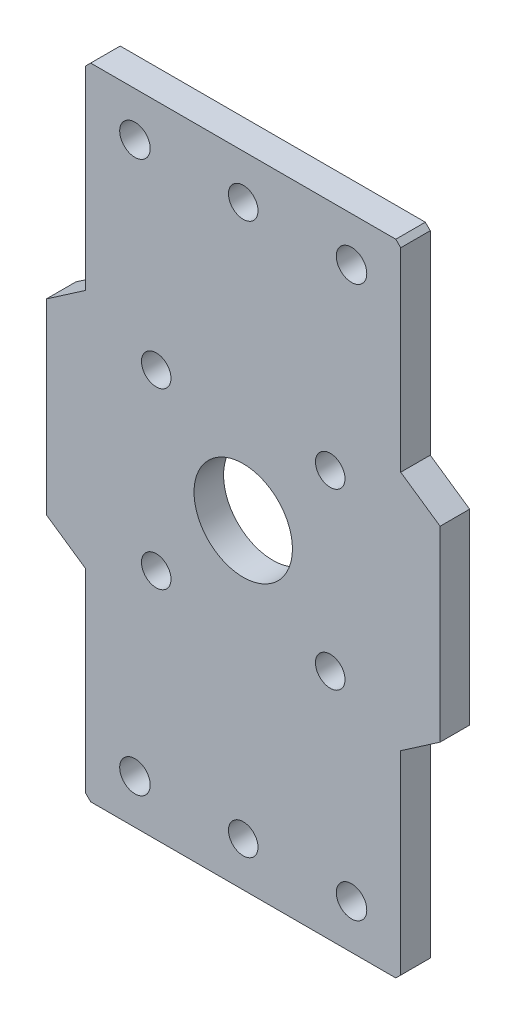
ISO-10303-21;
HEADER;
FILE_DESCRIPTION(('STEP AP214'),'2;1');
FILE_NAME('part.step','',(''),(''),'','','');
FILE_SCHEMA(('AUTOMOTIVE_DESIGN { 1 0 10303 214 1 1 1 1 }'));
ENDSEC;
DATA;
#1=APPLICATION_CONTEXT('core data for automotive mechanical design processes');
#2=APPLICATION_PROTOCOL_DEFINITION('international standard','automotive_design',2000,#1);
#3=PRODUCT_CONTEXT('',#1,'mechanical');
#4=PRODUCT('Part','Part','',(#3));
#5=PRODUCT_RELATED_PRODUCT_CATEGORY('part','',(#4));
#6=PRODUCT_DEFINITION_FORMATION('','',#4);
#7=PRODUCT_DEFINITION_CONTEXT('part definition',#1,'design');
#8=PRODUCT_DEFINITION('design','',#6,#7);
#9=PRODUCT_DEFINITION_SHAPE('','',#8);
#10=(LENGTH_UNIT() NAMED_UNIT(*) SI_UNIT(.MILLI.,.METRE.));
#11=(NAMED_UNIT(*) PLANE_ANGLE_UNIT() SI_UNIT($,.RADIAN.));
#12=(NAMED_UNIT(*) SI_UNIT($,.STERADIAN.) SOLID_ANGLE_UNIT());
#13=UNCERTAINTY_MEASURE_WITH_UNIT(LENGTH_MEASURE(1.E-05),#10,'distance_accuracy_value','');
#14=(GEOMETRIC_REPRESENTATION_CONTEXT(3) GLOBAL_UNCERTAINTY_ASSIGNED_CONTEXT((#13)) GLOBAL_UNIT_ASSIGNED_CONTEXT((#10,
#11,#12)) REPRESENTATION_CONTEXT('',''));
#15=CARTESIAN_POINT('',(0.,0.,0.));
#16=DIRECTION('',(0.,0.,1.));
#17=DIRECTION('',(1.,0.,0.));
#18=AXIS2_PLACEMENT_3D('',#15,#16,#17);
#19=CARTESIAN_POINT('',(0.,0.,3.));
#20=DIRECTION('',(0.,0.,1.));
#21=DIRECTION('',(1.,0.,0.));
#22=AXIS2_PLACEMENT_3D('',#19,#20,#21);
#23=PLANE('',#22);
#24=DIRECTION('',(0.,-1.,0.));
#25=VECTOR('',#24,1.);
#26=CARTESIAN_POINT('',(16.,0.,3.));
#27=LINE('',#26,#25);
#28=CARTESIAN_POINT('',(16.,57.2500000000001,3.));
#29=VERTEX_POINT('',#28);
#30=CARTESIAN_POINT('',(16.,37.5,3.));
#31=VERTEX_POINT('',#30);
#32=EDGE_CURVE('E277',#29,#31,#27,.T.);
#33=ORIENTED_EDGE('',*,*,#32,.F.);
#34=DIRECTION('',(-0.707106781186548,0.707106781186548,0.));
#35=VECTOR('',#34,1.);
#36=CARTESIAN_POINT('',(36.625,36.625,3.));
#37=LINE('',#36,#35);
#38=CARTESIAN_POINT('',(15.5,57.75,3.));
#39=VERTEX_POINT('',#38);
#40=EDGE_CURVE('E344',#29,#39,#37,.T.);
#41=ORIENTED_EDGE('',*,*,#40,.T.);
#42=DIRECTION('',(1.,0.,0.));
#43=VECTOR('',#42,1.);
#44=CARTESIAN_POINT('',(-16.,57.75,3.));
#45=LINE('',#44,#43);
#46=CARTESIAN_POINT('',(-15.5,57.75,3.));
#47=VERTEX_POINT('',#46);
#48=EDGE_CURVE('E381',#47,#39,#45,.T.);
#49=ORIENTED_EDGE('',*,*,#48,.F.);
#50=DIRECTION('',(0.707106781186544,0.707106781186551,0.));
#51=VECTOR('',#50,1.);
#52=CARTESIAN_POINT('',(-36.6250000000001,36.6249999999997,3.));
#53=LINE('',#52,#51);
#54=CARTESIAN_POINT('',(-16.,57.25,3.));
#55=VERTEX_POINT('',#54);
#56=EDGE_CURVE('E239',#47,#55,#53,.F.);
#57=ORIENTED_EDGE('',*,*,#56,.T.);
#58=DIRECTION('',(0.,-1.,0.));
#59=VECTOR('',#58,1.);
#60=CARTESIAN_POINT('',(-16.,0.,3.));
#61=LINE('',#60,#59);
#62=CARTESIAN_POINT('',(-16.,37.5,3.));
#63=VERTEX_POINT('',#62);
#64=EDGE_CURVE('E230',#55,#63,#61,.T.);
#65=ORIENTED_EDGE('',*,*,#64,.T.);
#66=DIRECTION('',(0.824041924199369,0.566528822887063,0.));
#67=VECTOR('',#66,1.);
#68=CARTESIAN_POINT('',(-22.6419098143235,32.9336870026526,3.));
#69=LINE('',#68,#67);
#70=CARTESIAN_POINT('',(-20.,34.75,3.));
#71=VERTEX_POINT('',#70);
#72=EDGE_CURVE('E236',#71,#63,#69,.T.);
#73=ORIENTED_EDGE('',*,*,#72,.F.);
#74=DIRECTION('',(0.,1.,0.));
#75=VECTOR('',#74,1.);
#76=CARTESIAN_POINT('',(-20.,0.,3.));
#77=LINE('',#76,#75);
#78=CARTESIAN_POINT('',(-20.,15.75,3.));
#79=VERTEX_POINT('',#78);
#80=EDGE_CURVE('E256',#79,#71,#77,.T.);
#81=ORIENTED_EDGE('',*,*,#80,.F.);
#82=DIRECTION('',(-0.824041924199368,0.566528822887065,0.));
#83=VECTOR('',#82,1.);
#84=CARTESIAN_POINT('',(0.933687002652549,1.35809018567643,3.));
#85=LINE('',#84,#83);
#86=CARTESIAN_POINT('',(-16.,13.,3.));
#87=VERTEX_POINT('',#86);
#88=EDGE_CURVE('E258',#87,#79,#85,.T.);
#89=ORIENTED_EDGE('',*,*,#88,.F.);
#90=DIRECTION('',(0.,-1.,0.));
#91=VECTOR('',#90,1.);
#92=CARTESIAN_POINT('',(-16.,0.,3.));
#93=LINE('',#92,#91);
#94=CARTESIAN_POINT('',(-16.,-6.74999999999991,3.));
#95=VERTEX_POINT('',#94);
#96=EDGE_CURVE('E264',#87,#95,#93,.T.);
#97=ORIENTED_EDGE('',*,*,#96,.T.);
#98=DIRECTION('',(-0.707106781186548,0.707106781186548,0.));
#99=VECTOR('',#98,1.);
#100=CARTESIAN_POINT('',(-11.375,-11.375,3.));
#101=LINE('',#100,#99);
#102=CARTESIAN_POINT('',(-15.5,-7.24999999999997,3.));
#103=VERTEX_POINT('',#102);
#104=EDGE_CURVE('E339',#95,#103,#101,.F.);
#105=ORIENTED_EDGE('',*,*,#104,.T.);
#106=DIRECTION('',(-1.,0.,0.));
#107=VECTOR('',#106,1.);
#108=CARTESIAN_POINT('',(16.,-7.24999999999997,3.));
#109=LINE('',#108,#107);
#110=CARTESIAN_POINT('',(15.5,-7.24999999999997,3.));
#111=VERTEX_POINT('',#110);
#112=EDGE_CURVE('E379',#111,#103,#109,.T.);
#113=ORIENTED_EDGE('',*,*,#112,.F.);
#114=DIRECTION('',(0.707106781186548,0.707106781186548,0.));
#115=VECTOR('',#114,1.);
#116=CARTESIAN_POINT('',(11.375,-11.375,3.));
#117=LINE('',#116,#115);
#118=CARTESIAN_POINT('',(16.,-6.74999999999994,3.));
#119=VERTEX_POINT('',#118);
#120=EDGE_CURVE('E341',#111,#119,#117,.T.);
#121=ORIENTED_EDGE('',*,*,#120,.T.);
#122=DIRECTION('',(0.,-1.,0.));
#123=VECTOR('',#122,1.);
#124=CARTESIAN_POINT('',(16.,0.,3.));
#125=LINE('',#124,#123);
#126=CARTESIAN_POINT('',(16.,13.0000000000001,3.));
#127=VERTEX_POINT('',#126);
#128=EDGE_CURVE('E267',#127,#119,#125,.T.);
#129=ORIENTED_EDGE('',*,*,#128,.F.);
#130=DIRECTION('',(0.824041924199367,0.566528822887066,0.));
#131=VECTOR('',#130,1.);
#132=CARTESIAN_POINT('',(-0.933687002652538,1.35809018567642,3.));
#133=LINE('',#132,#131);
#134=CARTESIAN_POINT('',(20.,15.7500000000001,3.));
#135=VERTEX_POINT('',#134);
#136=EDGE_CURVE('E270',#127,#135,#133,.T.);
#137=ORIENTED_EDGE('',*,*,#136,.T.);
#138=DIRECTION('',(0.,1.,0.));
#139=VECTOR('',#138,1.);
#140=CARTESIAN_POINT('',(20.,0.,3.));
#141=LINE('',#140,#139);
#142=CARTESIAN_POINT('',(20.,34.7500000000001,3.));
#143=VERTEX_POINT('',#142);
#144=EDGE_CURVE('E272',#135,#143,#141,.T.);
#145=ORIENTED_EDGE('',*,*,#144,.T.);
#146=DIRECTION('',(-0.824041924199369,0.566528822887063,0.));
#147=VECTOR('',#146,1.);
#148=CARTESIAN_POINT('',(22.6419098143235,32.9336870026526,3.));
#149=LINE('',#148,#147);
#150=EDGE_CURVE('E274',#143,#31,#149,.T.);
#151=ORIENTED_EDGE('',*,*,#150,.T.);
#152=EDGE_LOOP('',(#33,#41,#49,#57,#65,#73,#81,#89,#97,#105,#113,#121,#129,#137,#145,#151));
#153=FACE_BOUND('',#152,.T.);
#154=CARTESIAN_POINT('',(0.,-2.74999999999997,3.));
#155=DIRECTION('',(0.,0.,1.));
#156=DIRECTION('',(1.,0.,0.));
#157=AXIS2_PLACEMENT_3D('',#154,#155,#156);
#158=CIRCLE('',#157,1.5);
#159=CARTESIAN_POINT('',(1.5,-2.74999999999997,3.));
#160=VERTEX_POINT('',#159);
#161=EDGE_CURVE('E393',#160,#160,#158,.T.);
#162=ORIENTED_EDGE('',*,*,#161,.F.);
#163=EDGE_LOOP('',(#162));
#164=FACE_BOUND('',#163,.T.);
#165=CARTESIAN_POINT('',(0.,53.25,3.));
#166=DIRECTION('',(0.,0.,1.));
#167=DIRECTION('',(1.,0.,0.));
#168=AXIS2_PLACEMENT_3D('',#165,#166,#167);
#169=CIRCLE('',#168,1.5);
#170=CARTESIAN_POINT('',(1.49999999999997,53.25,3.));
#171=VERTEX_POINT('',#170);
#172=EDGE_CURVE('E389',#171,#171,#169,.T.);
#173=ORIENTED_EDGE('',*,*,#172,.F.);
#174=EDGE_LOOP('',(#173));
#175=FACE_BOUND('',#174,.T.);
#176=CARTESIAN_POINT('',(-11.,-2.74999999999997,3.));
#177=DIRECTION('',(0.,0.,1.));
#178=DIRECTION('',(1.,0.,0.));
#179=AXIS2_PLACEMENT_3D('',#176,#177,#178);
#180=CIRCLE('',#179,1.55);
#181=CARTESIAN_POINT('',(-9.45,-2.74999999999997,3.));
#182=VERTEX_POINT('',#181);
#183=EDGE_CURVE('E417',#182,#182,#180,.T.);
#184=ORIENTED_EDGE('',*,*,#183,.F.);
#185=EDGE_LOOP('',(#184));
#186=FACE_BOUND('',#185,.T.);
#187=CARTESIAN_POINT('',(11.,-2.74999999999994,3.));
#188=DIRECTION('',(0.,0.,1.));
#189=DIRECTION('',(1.,0.,0.));
#190=AXIS2_PLACEMENT_3D('',#187,#188,#189);
#191=CIRCLE('',#190,1.55);
#192=CARTESIAN_POINT('',(12.55,-2.74999999999994,3.));
#193=VERTEX_POINT('',#192);
#194=EDGE_CURVE('E331',#193,#193,#191,.T.);
#195=ORIENTED_EDGE('',*,*,#194,.F.);
#196=EDGE_LOOP('',(#195));
#197=FACE_BOUND('',#196,.T.);
#198=CARTESIAN_POINT('',(0.,25.25,3.));
#199=DIRECTION('',(0.,0.,1.));
#200=DIRECTION('',(1.,0.,0.));
#201=AXIS2_PLACEMENT_3D('',#198,#199,#200);
#202=CIRCLE('',#201,5.);
#203=CARTESIAN_POINT('',(5.,25.25,3.));
#204=VERTEX_POINT('',#203);
#205=EDGE_CURVE('E336',#204,#204,#202,.T.);
#206=ORIENTED_EDGE('',*,*,#205,.F.);
#207=EDGE_LOOP('',(#206));
#208=FACE_BOUND('',#207,.T.);
#209=CARTESIAN_POINT('',(-8.83883476483189,34.0888347648319,3.));
#210=DIRECTION('',(0.,0.,1.));
#211=DIRECTION('',(1.,0.,0.));
#212=AXIS2_PLACEMENT_3D('',#209,#210,#211);
#213=CIRCLE('',#212,1.5);
#214=CARTESIAN_POINT('',(-7.33883476483189,34.0888347648319,3.));
#215=VERTEX_POINT('',#214);
#216=EDGE_CURVE('E335',#215,#215,#213,.T.);
#217=ORIENTED_EDGE('',*,*,#216,.F.);
#218=EDGE_LOOP('',(#217));
#219=FACE_BOUND('',#218,.T.);
#220=CARTESIAN_POINT('',(8.83883476483184,16.4111652351682,3.));
#221=DIRECTION('',(0.,0.,1.));
#222=DIRECTION('',(1.,0.,0.));
#223=AXIS2_PLACEMENT_3D('',#220,#221,#222);
#224=CIRCLE('',#223,1.5);
#225=CARTESIAN_POINT('',(10.3388347648318,16.4111652351682,3.));
#226=VERTEX_POINT('',#225);
#227=EDGE_CURVE('E406',#226,#226,#224,.T.);
#228=ORIENTED_EDGE('',*,*,#227,.F.);
#229=EDGE_LOOP('',(#228));
#230=FACE_BOUND('',#229,.T.);
#231=CARTESIAN_POINT('',(-8.83883476483189,16.4111652351683,3.));
#232=DIRECTION('',(0.,0.,1.));
#233=DIRECTION('',(1.,0.,0.));
#234=AXIS2_PLACEMENT_3D('',#231,#232,#233);
#235=CIRCLE('',#234,1.5);
#236=CARTESIAN_POINT('',(-7.33883476483188,16.4111652351683,3.));
#237=VERTEX_POINT('',#236);
#238=EDGE_CURVE('E403',#237,#237,#235,.T.);
#239=ORIENTED_EDGE('',*,*,#238,.F.);
#240=EDGE_LOOP('',(#239));
#241=FACE_BOUND('',#240,.T.);
#242=CARTESIAN_POINT('',(8.83883476483182,34.0888347648319,3.));
#243=DIRECTION('',(0.,0.,1.));
#244=DIRECTION('',(1.,0.,0.));
#245=AXIS2_PLACEMENT_3D('',#242,#243,#244);
#246=CIRCLE('',#245,1.5);
#247=CARTESIAN_POINT('',(10.3388347648318,34.0888347648319,3.));
#248=VERTEX_POINT('',#247);
#249=EDGE_CURVE('E322',#248,#248,#246,.T.);
#250=ORIENTED_EDGE('',*,*,#249,.F.);
#251=EDGE_LOOP('',(#250));
#252=FACE_BOUND('',#251,.T.);
#253=CARTESIAN_POINT('',(11.,53.25,3.));
#254=DIRECTION('',(0.,0.,1.));
#255=DIRECTION('',(1.,0.,0.));
#256=AXIS2_PLACEMENT_3D('',#253,#254,#255);
#257=CIRCLE('',#256,1.55);
#258=CARTESIAN_POINT('',(12.55,53.25,3.));
#259=VERTEX_POINT('',#258);
#260=EDGE_CURVE('E424',#259,#259,#257,.T.);
#261=ORIENTED_EDGE('',*,*,#260,.F.);
#262=EDGE_LOOP('',(#261));
#263=FACE_BOUND('',#262,.T.);
#264=CARTESIAN_POINT('',(-11.,53.25,3.));
#265=DIRECTION('',(0.,0.,1.));
#266=DIRECTION('',(1.,0.,0.));
#267=AXIS2_PLACEMENT_3D('',#264,#265,#266);
#268=CIRCLE('',#267,1.55);
#269=CARTESIAN_POINT('',(-9.45000000000003,53.25,3.));
#270=VERTEX_POINT('',#269);
#271=EDGE_CURVE('E430',#270,#270,#268,.T.);
#272=ORIENTED_EDGE('',*,*,#271,.F.);
#273=EDGE_LOOP('',(#272));
#274=FACE_BOUND('',#273,.T.);
#275=ADVANCED_FACE('F113',(#153,#164,#175,#186,#197,#208,#219,#230,#241,#252,#263,#274),#23,.T.);
#276=CARTESIAN_POINT('',(0.,0.,0.));
#277=DIRECTION('',(0.,0.,1.));
#278=DIRECTION('',(1.,0.,0.));
#279=AXIS2_PLACEMENT_3D('',#276,#277,#278);
#280=PLANE('',#279);
#281=DIRECTION('',(1.,0.,0.));
#282=VECTOR('',#281,1.);
#283=CARTESIAN_POINT('',(0.,57.75,0.));
#284=LINE('',#283,#282);
#285=CARTESIAN_POINT('',(-15.5,57.75,0.));
#286=VERTEX_POINT('',#285);
#287=CARTESIAN_POINT('',(15.5,57.75,0.));
#288=VERTEX_POINT('',#287);
#289=EDGE_CURVE('E384',#286,#288,#284,.T.);
#290=ORIENTED_EDGE('',*,*,#289,.T.);
#291=DIRECTION('',(0.707106781186548,-0.707106781186548,0.));
#292=VECTOR('',#291,1.);
#293=CARTESIAN_POINT('',(16.,57.2500000000001,0.));
#294=LINE('',#293,#292);
#295=CARTESIAN_POINT('',(16.,57.2500000000001,0.));
#296=VERTEX_POINT('',#295);
#297=EDGE_CURVE('E356',#288,#296,#294,.T.);
#298=ORIENTED_EDGE('',*,*,#297,.T.);
#299=DIRECTION('',(0.,-1.,0.));
#300=VECTOR('',#299,1.);
#301=CARTESIAN_POINT('',(16.,0.,0.));
#302=LINE('',#301,#300);
#303=CARTESIAN_POINT('',(16.,37.5,0.));
#304=VERTEX_POINT('',#303);
#305=EDGE_CURVE('E242',#296,#304,#302,.T.);
#306=ORIENTED_EDGE('',*,*,#305,.T.);
#307=DIRECTION('',(-0.824041924199369,0.566528822887063,0.));
#308=VECTOR('',#307,1.);
#309=CARTESIAN_POINT('',(22.6419098143235,32.9336870026526,0.));
#310=LINE('',#309,#308);
#311=CARTESIAN_POINT('',(20.,34.7500000000001,0.));
#312=VERTEX_POINT('',#311);
#313=EDGE_CURVE('E299',#312,#304,#310,.T.);
#314=ORIENTED_EDGE('',*,*,#313,.F.);
#315=DIRECTION('',(0.,1.,0.));
#316=VECTOR('',#315,1.);
#317=CARTESIAN_POINT('',(20.,0.,0.));
#318=LINE('',#317,#316);
#319=CARTESIAN_POINT('',(20.,15.7500000000001,0.));
#320=VERTEX_POINT('',#319);
#321=EDGE_CURVE('E297',#320,#312,#318,.T.);
#322=ORIENTED_EDGE('',*,*,#321,.F.);
#323=DIRECTION('',(0.824041924199367,0.566528822887066,0.));
#324=VECTOR('',#323,1.);
#325=CARTESIAN_POINT('',(-0.933687002652538,1.35809018567642,0.));
#326=LINE('',#325,#324);
#327=CARTESIAN_POINT('',(16.,13.0000000000001,0.));
#328=VERTEX_POINT('',#327);
#329=EDGE_CURVE('E295',#328,#320,#326,.T.);
#330=ORIENTED_EDGE('',*,*,#329,.F.);
#331=DIRECTION('',(0.,-1.,0.));
#332=VECTOR('',#331,1.);
#333=CARTESIAN_POINT('',(16.,0.,0.));
#334=LINE('',#333,#332);
#335=CARTESIAN_POINT('',(16.,-6.74999999999994,0.));
#336=VERTEX_POINT('',#335);
#337=EDGE_CURVE('E292',#328,#336,#334,.T.);
#338=ORIENTED_EDGE('',*,*,#337,.T.);
#339=DIRECTION('',(-0.707106781186548,-0.707106781186548,0.));
#340=VECTOR('',#339,1.);
#341=CARTESIAN_POINT('',(15.5,-7.24999999999997,0.));
#342=LINE('',#341,#340);
#343=CARTESIAN_POINT('',(15.5,-7.24999999999997,0.));
#344=VERTEX_POINT('',#343);
#345=EDGE_CURVE('E352',#336,#344,#342,.T.);
#346=ORIENTED_EDGE('',*,*,#345,.T.);
#347=DIRECTION('',(-1.,0.,0.));
#348=VECTOR('',#347,1.);
#349=CARTESIAN_POINT('',(0.,-7.24999999999997,0.));
#350=LINE('',#349,#348);
#351=CARTESIAN_POINT('',(-15.5,-7.24999999999997,0.));
#352=VERTEX_POINT('',#351);
#353=EDGE_CURVE('E380',#344,#352,#350,.T.);
#354=ORIENTED_EDGE('',*,*,#353,.T.);
#355=DIRECTION('',(0.707106781186548,-0.707106781186548,0.));
#356=VECTOR('',#355,1.);
#357=CARTESIAN_POINT('',(-16.,-6.74999999999992,0.));
#358=LINE('',#357,#356);
#359=CARTESIAN_POINT('',(-16.,-6.74999999999991,0.));
#360=VERTEX_POINT('',#359);
#361=EDGE_CURVE('E129',#352,#360,#358,.F.);
#362=ORIENTED_EDGE('',*,*,#361,.T.);
#363=DIRECTION('',(0.,-1.,0.));
#364=VECTOR('',#363,1.);
#365=CARTESIAN_POINT('',(-16.,0.,0.));
#366=LINE('',#365,#364);
#367=CARTESIAN_POINT('',(-16.,13.,0.));
#368=VERTEX_POINT('',#367);
#369=EDGE_CURVE('E290',#368,#360,#366,.T.);
#370=ORIENTED_EDGE('',*,*,#369,.F.);
#371=DIRECTION('',(-0.824041924199368,0.566528822887065,0.));
#372=VECTOR('',#371,1.);
#373=CARTESIAN_POINT('',(0.933687002652549,1.35809018567643,0.));
#374=LINE('',#373,#372);
#375=CARTESIAN_POINT('',(-20.,15.75,0.));
#376=VERTEX_POINT('',#375);
#377=EDGE_CURVE('E287',#368,#376,#374,.T.);
#378=ORIENTED_EDGE('',*,*,#377,.T.);
#379=DIRECTION('',(0.,1.,0.));
#380=VECTOR('',#379,1.);
#381=CARTESIAN_POINT('',(-20.,0.,0.));
#382=LINE('',#381,#380);
#383=CARTESIAN_POINT('',(-20.,34.75,0.));
#384=VERTEX_POINT('',#383);
#385=EDGE_CURVE('E284',#376,#384,#382,.T.);
#386=ORIENTED_EDGE('',*,*,#385,.T.);
#387=DIRECTION('',(0.824041924199369,0.566528822887063,0.));
#388=VECTOR('',#387,1.);
#389=CARTESIAN_POINT('',(-22.6419098143235,32.9336870026526,0.));
#390=LINE('',#389,#388);
#391=CARTESIAN_POINT('',(-16.,37.5,0.));
#392=VERTEX_POINT('',#391);
#393=EDGE_CURVE('E281',#384,#392,#390,.T.);
#394=ORIENTED_EDGE('',*,*,#393,.T.);
#395=DIRECTION('',(0.,-1.,0.));
#396=VECTOR('',#395,1.);
#397=CARTESIAN_POINT('',(-16.,0.,0.));
#398=LINE('',#397,#396);
#399=CARTESIAN_POINT('',(-16.,57.25,0.));
#400=VERTEX_POINT('',#399);
#401=EDGE_CURVE('E248',#400,#392,#398,.T.);
#402=ORIENTED_EDGE('',*,*,#401,.F.);
#403=DIRECTION('',(-0.707106781186544,-0.707106781186551,0.));
#404=VECTOR('',#403,1.);
#405=CARTESIAN_POINT('',(-15.5,57.75,0.));
#406=LINE('',#405,#404);
#407=EDGE_CURVE('E354',#400,#286,#406,.F.);
#408=ORIENTED_EDGE('',*,*,#407,.T.);
#409=EDGE_LOOP('',(#290,#298,#306,#314,#322,#330,#338,#346,#354,#362,#370,#378,#386,#394,#402,#408));
#410=FACE_BOUND('',#409,.T.);
#411=CARTESIAN_POINT('',(0.,-2.74999999999997,0.));
#412=DIRECTION('',(0.,0.,1.));
#413=DIRECTION('',(1.,0.,0.));
#414=AXIS2_PLACEMENT_3D('',#411,#412,#413);
#415=CIRCLE('',#414,1.5);
#416=CARTESIAN_POINT('',(1.5,-2.74999999999997,0.));
#417=VERTEX_POINT('',#416);
#418=EDGE_CURVE('E390',#417,#417,#415,.T.);
#419=ORIENTED_EDGE('',*,*,#418,.T.);
#420=EDGE_LOOP('',(#419));
#421=FACE_BOUND('',#420,.T.);
#422=CARTESIAN_POINT('',(0.,53.25,0.));
#423=DIRECTION('',(0.,0.,1.));
#424=DIRECTION('',(1.,0.,0.));
#425=AXIS2_PLACEMENT_3D('',#422,#423,#424);
#426=CIRCLE('',#425,1.5);
#427=CARTESIAN_POINT('',(1.49999999999997,53.25,0.));
#428=VERTEX_POINT('',#427);
#429=EDGE_CURVE('E396',#428,#428,#426,.T.);
#430=ORIENTED_EDGE('',*,*,#429,.T.);
#431=EDGE_LOOP('',(#430));
#432=FACE_BOUND('',#431,.T.);
#433=CARTESIAN_POINT('',(-11.,53.25,0.));
#434=DIRECTION('',(0.,0.,1.));
#435=DIRECTION('',(1.,0.,0.));
#436=AXIS2_PLACEMENT_3D('',#433,#434,#435);
#437=CIRCLE('',#436,1.55);
#438=CARTESIAN_POINT('',(-9.45000000000003,53.25,0.));
#439=VERTEX_POINT('',#438);
#440=EDGE_CURVE('E282',#439,#439,#437,.F.);
#441=ORIENTED_EDGE('',*,*,#440,.F.);
#442=EDGE_LOOP('',(#441));
#443=FACE_BOUND('',#442,.T.);
#444=CARTESIAN_POINT('',(11.,53.25,0.));
#445=DIRECTION('',(0.,0.,1.));
#446=DIRECTION('',(1.,0.,0.));
#447=AXIS2_PLACEMENT_3D('',#444,#445,#446);
#448=CIRCLE('',#447,1.55);
#449=CARTESIAN_POINT('',(12.55,53.25,0.));
#450=VERTEX_POINT('',#449);
#451=EDGE_CURVE('E427',#450,#450,#448,.F.);
#452=ORIENTED_EDGE('',*,*,#451,.F.);
#453=EDGE_LOOP('',(#452));
#454=FACE_BOUND('',#453,.T.);
#455=CARTESIAN_POINT('',(8.83883476483182,34.0888347648319,0.));
#456=DIRECTION('',(0.,0.,1.));
#457=DIRECTION('',(1.,0.,0.));
#458=AXIS2_PLACEMENT_3D('',#455,#456,#457);
#459=CIRCLE('',#458,1.5);
#460=CARTESIAN_POINT('',(10.3388347648318,34.0888347648319,0.));
#461=VERTEX_POINT('',#460);
#462=EDGE_CURVE('E318',#461,#461,#459,.T.);
#463=ORIENTED_EDGE('',*,*,#462,.T.);
#464=EDGE_LOOP('',(#463));
#465=FACE_BOUND('',#464,.T.);
#466=CARTESIAN_POINT('',(-8.83883476483189,16.4111652351683,0.));
#467=DIRECTION('',(0.,0.,1.));
#468=DIRECTION('',(1.,0.,0.));
#469=AXIS2_PLACEMENT_3D('',#466,#467,#468);
#470=CIRCLE('',#469,1.5);
#471=CARTESIAN_POINT('',(-7.33883476483188,16.4111652351683,0.));
#472=VERTEX_POINT('',#471);
#473=EDGE_CURVE('E321',#472,#472,#470,.T.);
#474=ORIENTED_EDGE('',*,*,#473,.T.);
#475=EDGE_LOOP('',(#474));
#476=FACE_BOUND('',#475,.T.);
#477=CARTESIAN_POINT('',(8.83883476483184,16.4111652351682,0.));
#478=DIRECTION('',(0.,0.,1.));
#479=DIRECTION('',(1.,0.,0.));
#480=AXIS2_PLACEMENT_3D('',#477,#478,#479);
#481=CIRCLE('',#480,1.5);
#482=CARTESIAN_POINT('',(10.3388347648318,16.4111652351682,0.));
#483=VERTEX_POINT('',#482);
#484=EDGE_CURVE('E325',#483,#483,#481,.T.);
#485=ORIENTED_EDGE('',*,*,#484,.T.);
#486=EDGE_LOOP('',(#485));
#487=FACE_BOUND('',#486,.T.);
#488=CARTESIAN_POINT('',(-8.83883476483189,34.0888347648319,0.));
#489=DIRECTION('',(0.,0.,1.));
#490=DIRECTION('',(1.,0.,0.));
#491=AXIS2_PLACEMENT_3D('',#488,#489,#490);
#492=CIRCLE('',#491,1.5);
#493=CARTESIAN_POINT('',(-7.33883476483189,34.0888347648319,0.));
#494=VERTEX_POINT('',#493);
#495=EDGE_CURVE('E328',#494,#494,#492,.T.);
#496=ORIENTED_EDGE('',*,*,#495,.T.);
#497=EDGE_LOOP('',(#496));
#498=FACE_BOUND('',#497,.T.);
#499=CARTESIAN_POINT('',(0.,25.25,0.));
#500=DIRECTION('',(0.,0.,1.));
#501=DIRECTION('',(1.,0.,0.));
#502=AXIS2_PLACEMENT_3D('',#499,#500,#501);
#503=CIRCLE('',#502,5.);
#504=CARTESIAN_POINT('',(5.,25.25,0.));
#505=VERTEX_POINT('',#504);
#506=EDGE_CURVE('E332',#505,#505,#503,.T.);
#507=ORIENTED_EDGE('',*,*,#506,.T.);
#508=EDGE_LOOP('',(#507));
#509=FACE_BOUND('',#508,.T.);
#510=CARTESIAN_POINT('',(-11.,-2.74999999999997,0.));
#511=DIRECTION('',(0.,0.,1.));
#512=DIRECTION('',(1.,0.,0.));
#513=AXIS2_PLACEMENT_3D('',#510,#511,#512);
#514=CIRCLE('',#513,1.55);
#515=CARTESIAN_POINT('',(-9.45,-2.74999999999997,0.));
#516=VERTEX_POINT('',#515);
#517=EDGE_CURVE('E413',#516,#516,#514,.F.);
#518=ORIENTED_EDGE('',*,*,#517,.F.);
#519=EDGE_LOOP('',(#518));
#520=FACE_BOUND('',#519,.T.);
#521=CARTESIAN_POINT('',(11.,-2.74999999999994,0.));
#522=DIRECTION('',(0.,0.,1.));
#523=DIRECTION('',(1.,0.,0.));
#524=AXIS2_PLACEMENT_3D('',#521,#522,#523);
#525=CIRCLE('',#524,1.55);
#526=CARTESIAN_POINT('',(12.55,-2.74999999999994,0.));
#527=VERTEX_POINT('',#526);
#528=EDGE_CURVE('E416',#527,#527,#525,.F.);
#529=ORIENTED_EDGE('',*,*,#528,.F.);
#530=EDGE_LOOP('',(#529));
#531=FACE_BOUND('',#530,.T.);
#532=ADVANCED_FACE('F372',(#410,#421,#432,#443,#454,#465,#476,#487,#498,#509,#520,#531),#280,.F.);
#533=CARTESIAN_POINT('',(-16.,0.,3.));
#534=DIRECTION('',(1.,0.,0.));
#535=DIRECTION('',(0.,1.,0.));
#536=AXIS2_PLACEMENT_3D('',#533,#534,#535);
#537=PLANE('',#536);
#538=ORIENTED_EDGE('',*,*,#64,.F.);
#539=DIRECTION('',(0.,0.,-1.));
#540=VECTOR('',#539,1.);
#541=CARTESIAN_POINT('',(-16.,57.25,3.));
#542=LINE('',#541,#540);
#543=EDGE_CURVE('E358',#55,#400,#542,.T.);
#544=ORIENTED_EDGE('',*,*,#543,.T.);
#545=ORIENTED_EDGE('',*,*,#401,.T.);
#546=DIRECTION('',(0.,0.,-1.));
#547=VECTOR('',#546,1.);
#548=CARTESIAN_POINT('',(-16.,37.5,3.));
#549=LINE('',#548,#547);
#550=EDGE_CURVE('E245',#63,#392,#549,.T.);
#551=ORIENTED_EDGE('',*,*,#550,.F.);
#552=EDGE_LOOP('',(#538,#544,#545,#551));
#553=FACE_BOUND('',#552,.T.);
#554=ADVANCED_FACE('F246',(#553),#537,.F.);
#555=CARTESIAN_POINT('',(-22.6419098143235,32.9336870026526,3.));
#556=DIRECTION('',(-0.566528822887063,0.824041924199369,0.));
#557=DIRECTION('',(-0.82404192419937,-0.566528822887063,0.));
#558=AXIS2_PLACEMENT_3D('',#555,#556,#557);
#559=PLANE('',#558);
#560=ORIENTED_EDGE('',*,*,#393,.F.);
#561=DIRECTION('',(0.,0.,-1.));
#562=VECTOR('',#561,1.);
#563=CARTESIAN_POINT('',(-20.,34.75,3.));
#564=LINE('',#563,#562);
#565=EDGE_CURVE('E253',#71,#384,#564,.T.);
#566=ORIENTED_EDGE('',*,*,#565,.F.);
#567=ORIENTED_EDGE('',*,*,#72,.T.);
#568=ORIENTED_EDGE('',*,*,#550,.T.);
#569=EDGE_LOOP('',(#560,#566,#567,#568));
#570=FACE_BOUND('',#569,.T.);
#571=ADVANCED_FACE('F255',(#570),#559,.T.);
#572=CARTESIAN_POINT('',(-20.,0.,3.));
#573=DIRECTION('',(-1.,0.,0.));
#574=DIRECTION('',(0.,0.,1.));
#575=AXIS2_PLACEMENT_3D('',#572,#573,#574);
#576=PLANE('',#575);
#577=ORIENTED_EDGE('',*,*,#385,.F.);
#578=DIRECTION('',(0.,0.,-1.));
#579=VECTOR('',#578,1.);
#580=CARTESIAN_POINT('',(-20.,15.75,3.));
#581=LINE('',#580,#579);
#582=EDGE_CURVE('E315',#79,#376,#581,.T.);
#583=ORIENTED_EDGE('',*,*,#582,.F.);
#584=ORIENTED_EDGE('',*,*,#80,.T.);
#585=ORIENTED_EDGE('',*,*,#565,.T.);
#586=EDGE_LOOP('',(#577,#583,#584,#585));
#587=FACE_BOUND('',#586,.T.);
#588=ADVANCED_FACE('F515',(#587),#576,.T.);
#589=CARTESIAN_POINT('',(0.933687002652549,1.35809018567643,3.));
#590=DIRECTION('',(-0.566528822887065,-0.824041924199367,0.));
#591=DIRECTION('',(0.824041924199368,-0.566528822887065,0.));
#592=AXIS2_PLACEMENT_3D('',#589,#590,#591);
#593=PLANE('',#592);
#594=ORIENTED_EDGE('',*,*,#377,.F.);
#595=DIRECTION('',(0.,0.,-1.));
#596=VECTOR('',#595,1.);
#597=CARTESIAN_POINT('',(-16.,13.,3.));
#598=LINE('',#597,#596);
#599=EDGE_CURVE('E313',#87,#368,#598,.T.);
#600=ORIENTED_EDGE('',*,*,#599,.F.);
#601=ORIENTED_EDGE('',*,*,#88,.T.);
#602=ORIENTED_EDGE('',*,*,#582,.T.);
#603=EDGE_LOOP('',(#594,#600,#601,#602));
#604=FACE_BOUND('',#603,.T.);
#605=ADVANCED_FACE('F511',(#604),#593,.T.);
#606=CARTESIAN_POINT('',(-16.,0.,3.));
#607=DIRECTION('',(1.,0.,0.));
#608=DIRECTION('',(0.,1.,0.));
#609=AXIS2_PLACEMENT_3D('',#606,#607,#608);
#610=PLANE('',#609);
#611=ORIENTED_EDGE('',*,*,#369,.T.);
#612=DIRECTION('',(0.,0.,1.));
#613=VECTOR('',#612,1.);
#614=CARTESIAN_POINT('',(-16.,-6.74999999999991,3.));
#615=LINE('',#614,#613);
#616=EDGE_CURVE('E12',#360,#95,#615,.T.);
#617=ORIENTED_EDGE('',*,*,#616,.T.);
#618=ORIENTED_EDGE('',*,*,#96,.F.);
#619=ORIENTED_EDGE('',*,*,#599,.T.);
#620=EDGE_LOOP('',(#611,#617,#618,#619));
#621=FACE_BOUND('',#620,.T.);
#622=ADVANCED_FACE('F508',(#621),#610,.F.);
#623=CARTESIAN_POINT('',(16.,0.,3.));
#624=DIRECTION('',(1.,0.,0.));
#625=DIRECTION('',(0.,1.,0.));
#626=AXIS2_PLACEMENT_3D('',#623,#624,#625);
#627=PLANE('',#626);
#628=ORIENTED_EDGE('',*,*,#128,.T.);
#629=DIRECTION('',(0.,0.,-1.));
#630=VECTOR('',#629,1.);
#631=CARTESIAN_POINT('',(16.,-6.74999999999994,0.));
#632=LINE('',#631,#630);
#633=EDGE_CURVE('E122',#119,#336,#632,.T.);
#634=ORIENTED_EDGE('',*,*,#633,.T.);
#635=ORIENTED_EDGE('',*,*,#337,.F.);
#636=DIRECTION('',(0.,0.,-1.));
#637=VECTOR('',#636,1.);
#638=CARTESIAN_POINT('',(16.,13.0000000000001,3.));
#639=LINE('',#638,#637);
#640=EDGE_CURVE('E311',#127,#328,#639,.T.);
#641=ORIENTED_EDGE('',*,*,#640,.F.);
#642=EDGE_LOOP('',(#628,#634,#635,#641));
#643=FACE_BOUND('',#642,.T.);
#644=ADVANCED_FACE('F366',(#643),#627,.T.);
#645=CARTESIAN_POINT('',(-0.933687002652538,1.35809018567642,3.));
#646=DIRECTION('',(-0.566528822887066,0.824041924199367,0.));
#647=DIRECTION('',(-0.824041924199367,-0.566528822887066,0.));
#648=AXIS2_PLACEMENT_3D('',#645,#646,#647);
#649=PLANE('',#648);
#650=ORIENTED_EDGE('',*,*,#329,.T.);
#651=DIRECTION('',(0.,0.,-1.));
#652=VECTOR('',#651,1.);
#653=CARTESIAN_POINT('',(20.,15.7500000000001,3.));
#654=LINE('',#653,#652);
#655=EDGE_CURVE('E308',#135,#320,#654,.T.);
#656=ORIENTED_EDGE('',*,*,#655,.F.);
#657=ORIENTED_EDGE('',*,*,#136,.F.);
#658=ORIENTED_EDGE('',*,*,#640,.T.);
#659=EDGE_LOOP('',(#650,#656,#657,#658));
#660=FACE_BOUND('',#659,.T.);
#661=ADVANCED_FACE('F501',(#660),#649,.F.);
#662=CARTESIAN_POINT('',(20.,0.,3.));
#663=DIRECTION('',(-1.,0.,0.));
#664=DIRECTION('',(0.,0.,1.));
#665=AXIS2_PLACEMENT_3D('',#662,#663,#664);
#666=PLANE('',#665);
#667=ORIENTED_EDGE('',*,*,#321,.T.);
#668=DIRECTION('',(0.,0.,-1.));
#669=VECTOR('',#668,1.);
#670=CARTESIAN_POINT('',(20.,34.7500000000001,3.));
#671=LINE('',#670,#669);
#672=EDGE_CURVE('E305',#143,#312,#671,.T.);
#673=ORIENTED_EDGE('',*,*,#672,.F.);
#674=ORIENTED_EDGE('',*,*,#144,.F.);
#675=ORIENTED_EDGE('',*,*,#655,.T.);
#676=EDGE_LOOP('',(#667,#673,#674,#675));
#677=FACE_BOUND('',#676,.T.);
#678=ADVANCED_FACE('F497',(#677),#666,.F.);
#679=CARTESIAN_POINT('',(22.6419098143235,32.9336870026526,3.));
#680=DIRECTION('',(-0.566528822887063,-0.824041924199369,0.));
#681=DIRECTION('',(0.82404192419937,-0.566528822887063,0.));
#682=AXIS2_PLACEMENT_3D('',#679,#680,#681);
#683=PLANE('',#682);
#684=ORIENTED_EDGE('',*,*,#313,.T.);
#685=DIRECTION('',(0.,0.,-1.));
#686=VECTOR('',#685,1.);
#687=CARTESIAN_POINT('',(16.,37.5,3.));
#688=LINE('',#687,#686);
#689=EDGE_CURVE('E279',#31,#304,#688,.T.);
#690=ORIENTED_EDGE('',*,*,#689,.F.);
#691=ORIENTED_EDGE('',*,*,#150,.F.);
#692=ORIENTED_EDGE('',*,*,#672,.T.);
#693=EDGE_LOOP('',(#684,#690,#691,#692));
#694=FACE_BOUND('',#693,.T.);
#695=ADVANCED_FACE('F491',(#694),#683,.F.);
#696=CARTESIAN_POINT('',(16.,0.,3.));
#697=DIRECTION('',(1.,0.,0.));
#698=DIRECTION('',(0.,1.,0.));
#699=AXIS2_PLACEMENT_3D('',#696,#697,#698);
#700=PLANE('',#699);
#701=ORIENTED_EDGE('',*,*,#305,.F.);
#702=DIRECTION('',(0.,0.,1.));
#703=VECTOR('',#702,1.);
#704=CARTESIAN_POINT('',(16.,57.2500000000001,3.));
#705=LINE('',#704,#703);
#706=EDGE_CURVE('E252',#296,#29,#705,.T.);
#707=ORIENTED_EDGE('',*,*,#706,.T.);
#708=ORIENTED_EDGE('',*,*,#32,.T.);
#709=ORIENTED_EDGE('',*,*,#689,.T.);
#710=EDGE_LOOP('',(#701,#707,#708,#709));
#711=FACE_BOUND('',#710,.T.);
#712=ADVANCED_FACE('F482',(#711),#700,.T.);
#713=CARTESIAN_POINT('',(-11.,53.25,-34.5785330028706));
#714=DIRECTION('',(0.,0.,1.));
#715=DIRECTION('',(1.,0.,0.));
#716=AXIS2_PLACEMENT_3D('',#713,#714,#715);
#717=CYLINDRICAL_SURFACE('',#716,1.55);
#718=ORIENTED_EDGE('',*,*,#440,.T.);
#719=EDGE_LOOP('',(#718));
#720=FACE_BOUND('',#719,.T.);
#721=ORIENTED_EDGE('',*,*,#271,.T.);
#722=EDGE_LOOP('',(#721));
#723=FACE_BOUND('',#722,.T.);
#724=ADVANCED_FACE('F480',(#720,#723),#717,.F.);
#725=CARTESIAN_POINT('',(11.,53.25,-34.5785330028706));
#726=DIRECTION('',(0.,0.,1.));
#727=DIRECTION('',(1.,0.,0.));
#728=AXIS2_PLACEMENT_3D('',#725,#726,#727);
#729=CYLINDRICAL_SURFACE('',#728,1.55);
#730=ORIENTED_EDGE('',*,*,#451,.T.);
#731=EDGE_LOOP('',(#730));
#732=FACE_BOUND('',#731,.T.);
#733=ORIENTED_EDGE('',*,*,#260,.T.);
#734=EDGE_LOOP('',(#733));
#735=FACE_BOUND('',#734,.T.);
#736=ADVANCED_FACE('F435',(#732,#735),#729,.F.);
#737=CARTESIAN_POINT('',(-11.,-2.74999999999997,-33.1174939552487));
#738=DIRECTION('',(0.,0.,1.));
#739=DIRECTION('',(1.,0.,0.));
#740=AXIS2_PLACEMENT_3D('',#737,#738,#739);
#741=CYLINDRICAL_SURFACE('',#740,1.55);
#742=ORIENTED_EDGE('',*,*,#517,.T.);
#743=EDGE_LOOP('',(#742));
#744=FACE_BOUND('',#743,.T.);
#745=ORIENTED_EDGE('',*,*,#183,.T.);
#746=EDGE_LOOP('',(#745));
#747=FACE_BOUND('',#746,.T.);
#748=ADVANCED_FACE('F459',(#744,#747),#741,.F.);
#749=CARTESIAN_POINT('',(11.,-2.74999999999994,-33.1174939552487));
#750=DIRECTION('',(0.,0.,1.));
#751=DIRECTION('',(1.,0.,0.));
#752=AXIS2_PLACEMENT_3D('',#749,#750,#751);
#753=CYLINDRICAL_SURFACE('',#752,1.55);
#754=ORIENTED_EDGE('',*,*,#528,.T.);
#755=EDGE_LOOP('',(#754));
#756=FACE_BOUND('',#755,.T.);
#757=ORIENTED_EDGE('',*,*,#194,.T.);
#758=EDGE_LOOP('',(#757));
#759=FACE_BOUND('',#758,.T.);
#760=ADVANCED_FACE('F455',(#756,#759),#753,.F.);
#761=CARTESIAN_POINT('',(8.83883476483182,34.0888347648319,-7.));
#762=DIRECTION('',(0.,0.,1.));
#763=DIRECTION('',(1.,0.,0.));
#764=AXIS2_PLACEMENT_3D('',#761,#762,#763);
#765=CYLINDRICAL_SURFACE('',#764,1.5);
#766=ORIENTED_EDGE('',*,*,#249,.T.);
#767=EDGE_LOOP('',(#766));
#768=FACE_BOUND('',#767,.T.);
#769=ORIENTED_EDGE('',*,*,#462,.F.);
#770=EDGE_LOOP('',(#769));
#771=FACE_BOUND('',#770,.T.);
#772=ADVANCED_FACE('F458',(#768,#771),#765,.F.);
#773=CARTESIAN_POINT('',(-8.83883476483189,16.4111652351683,-7.));
#774=DIRECTION('',(0.,0.,1.));
#775=DIRECTION('',(1.,0.,0.));
#776=AXIS2_PLACEMENT_3D('',#773,#774,#775);
#777=CYLINDRICAL_SURFACE('',#776,1.5);
#778=ORIENTED_EDGE('',*,*,#238,.T.);
#779=EDGE_LOOP('',(#778));
#780=FACE_BOUND('',#779,.T.);
#781=ORIENTED_EDGE('',*,*,#473,.F.);
#782=EDGE_LOOP('',(#781));
#783=FACE_BOUND('',#782,.T.);
#784=ADVANCED_FACE('F588',(#780,#783),#777,.F.);
#785=CARTESIAN_POINT('',(8.83883476483184,16.4111652351682,-7.));
#786=DIRECTION('',(0.,0.,1.));
#787=DIRECTION('',(1.,0.,0.));
#788=AXIS2_PLACEMENT_3D('',#785,#786,#787);
#789=CYLINDRICAL_SURFACE('',#788,1.5);
#790=ORIENTED_EDGE('',*,*,#227,.T.);
#791=EDGE_LOOP('',(#790));
#792=FACE_BOUND('',#791,.T.);
#793=ORIENTED_EDGE('',*,*,#484,.F.);
#794=EDGE_LOOP('',(#793));
#795=FACE_BOUND('',#794,.T.);
#796=ADVANCED_FACE('F591',(#792,#795),#789,.F.);
#797=CARTESIAN_POINT('',(-8.83883476483189,34.0888347648319,-7.));
#798=DIRECTION('',(0.,0.,1.));
#799=DIRECTION('',(1.,0.,0.));
#800=AXIS2_PLACEMENT_3D('',#797,#798,#799);
#801=CYLINDRICAL_SURFACE('',#800,1.5);
#802=ORIENTED_EDGE('',*,*,#216,.T.);
#803=EDGE_LOOP('',(#802));
#804=FACE_BOUND('',#803,.T.);
#805=ORIENTED_EDGE('',*,*,#495,.F.);
#806=EDGE_LOOP('',(#805));
#807=FACE_BOUND('',#806,.T.);
#808=ADVANCED_FACE('F586',(#804,#807),#801,.F.);
#809=CARTESIAN_POINT('',(0.,25.25,-7.));
#810=DIRECTION('',(0.,0.,1.));
#811=DIRECTION('',(1.,0.,0.));
#812=AXIS2_PLACEMENT_3D('',#809,#810,#811);
#813=CYLINDRICAL_SURFACE('',#812,5.);
#814=ORIENTED_EDGE('',*,*,#205,.T.);
#815=EDGE_LOOP('',(#814));
#816=FACE_BOUND('',#815,.T.);
#817=ORIENTED_EDGE('',*,*,#506,.F.);
#818=EDGE_LOOP('',(#817));
#819=FACE_BOUND('',#818,.T.);
#820=ADVANCED_FACE('F582',(#816,#819),#813,.F.);
#821=CARTESIAN_POINT('',(0.,53.25,0.));
#822=DIRECTION('',(0.,0.,1.));
#823=DIRECTION('',(1.,0.,0.));
#824=AXIS2_PLACEMENT_3D('',#821,#822,#823);
#825=CYLINDRICAL_SURFACE('',#824,1.5);
#826=ORIENTED_EDGE('',*,*,#429,.F.);
#827=EDGE_LOOP('',(#826));
#828=FACE_BOUND('',#827,.T.);
#829=ORIENTED_EDGE('',*,*,#172,.T.);
#830=EDGE_LOOP('',(#829));
#831=FACE_BOUND('',#830,.T.);
#832=ADVANCED_FACE('F576',(#828,#831),#825,.F.);
#833=CARTESIAN_POINT('',(0.,-2.74999999999997,0.));
#834=DIRECTION('',(0.,0.,1.));
#835=DIRECTION('',(1.,0.,0.));
#836=AXIS2_PLACEMENT_3D('',#833,#834,#835);
#837=CYLINDRICAL_SURFACE('',#836,1.5);
#838=ORIENTED_EDGE('',*,*,#418,.F.);
#839=EDGE_LOOP('',(#838));
#840=FACE_BOUND('',#839,.T.);
#841=ORIENTED_EDGE('',*,*,#161,.T.);
#842=EDGE_LOOP('',(#841));
#843=FACE_BOUND('',#842,.T.);
#844=ADVANCED_FACE('F569',(#840,#843),#837,.F.);
#845=CARTESIAN_POINT('',(-16.,57.75,-7.));
#846=DIRECTION('',(0.,-1.,0.));
#847=DIRECTION('',(0.,0.,-1.));
#848=AXIS2_PLACEMENT_3D('',#845,#846,#847);
#849=PLANE('',#848);
#850=ORIENTED_EDGE('',*,*,#48,.T.);
#851=DIRECTION('',(0.,0.,-1.));
#852=VECTOR('',#851,1.);
#853=CARTESIAN_POINT('',(15.5,57.75,0.));
#854=LINE('',#853,#852);
#855=EDGE_CURVE('E349',#39,#288,#854,.T.);
#856=ORIENTED_EDGE('',*,*,#855,.T.);
#857=ORIENTED_EDGE('',*,*,#289,.F.);
#858=DIRECTION('',(0.,0.,1.));
#859=VECTOR('',#858,1.);
#860=CARTESIAN_POINT('',(-15.5,57.75,-7.));
#861=LINE('',#860,#859);
#862=EDGE_CURVE('E346',#286,#47,#861,.T.);
#863=ORIENTED_EDGE('',*,*,#862,.T.);
#864=EDGE_LOOP('',(#850,#856,#857,#863));
#865=FACE_BOUND('',#864,.T.);
#866=ADVANCED_FACE('F556',(#865),#849,.F.);
#867=CARTESIAN_POINT('',(16.,-7.24999999999997,-7.));
#868=DIRECTION('',(0.,1.,0.));
#869=DIRECTION('',(0.,0.,1.));
#870=AXIS2_PLACEMENT_3D('',#867,#868,#869);
#871=PLANE('',#870);
#872=ORIENTED_EDGE('',*,*,#353,.F.);
#873=DIRECTION('',(0.,0.,1.));
#874=VECTOR('',#873,1.);
#875=CARTESIAN_POINT('',(15.5,-7.24999999999997,3.));
#876=LINE('',#875,#874);
#877=EDGE_CURVE('E361',#344,#111,#876,.T.);
#878=ORIENTED_EDGE('',*,*,#877,.T.);
#879=ORIENTED_EDGE('',*,*,#112,.T.);
#880=DIRECTION('',(0.,0.,-1.));
#881=VECTOR('',#880,1.);
#882=CARTESIAN_POINT('',(-15.5,-7.24999999999997,-7.));
#883=LINE('',#882,#881);
#884=EDGE_CURVE('E137',#103,#352,#883,.T.);
#885=ORIENTED_EDGE('',*,*,#884,.T.);
#886=EDGE_LOOP('',(#872,#878,#879,#885));
#887=FACE_BOUND('',#886,.T.);
#888=ADVANCED_FACE('F378',(#887),#871,.F.);
#889=CARTESIAN_POINT('',(16.,57.2500000000001,3.));
#890=DIRECTION('',(0.707106781186548,0.707106781186548,0.));
#891=DIRECTION('',(0.,0.,-1.));
#892=AXIS2_PLACEMENT_3D('',#889,#890,#891);
#893=PLANE('',#892);
#894=ORIENTED_EDGE('',*,*,#297,.F.);
#895=ORIENTED_EDGE('',*,*,#855,.F.);
#896=ORIENTED_EDGE('',*,*,#40,.F.);
#897=ORIENTED_EDGE('',*,*,#706,.F.);
#898=EDGE_LOOP('',(#894,#895,#896,#897));
#899=FACE_BOUND('',#898,.T.);
#900=ADVANCED_FACE('F525',(#899),#893,.T.);
#901=CARTESIAN_POINT('',(-15.5,57.75,-7.));
#902=DIRECTION('',(0.707106781186551,-0.707106781186544,0.));
#903=DIRECTION('',(0.,0.,1.));
#904=AXIS2_PLACEMENT_3D('',#901,#902,#903);
#905=PLANE('',#904);
#906=ORIENTED_EDGE('',*,*,#407,.F.);
#907=ORIENTED_EDGE('',*,*,#543,.F.);
#908=ORIENTED_EDGE('',*,*,#56,.F.);
#909=ORIENTED_EDGE('',*,*,#862,.F.);
#910=EDGE_LOOP('',(#906,#907,#908,#909));
#911=FACE_BOUND('',#910,.T.);
#912=ADVANCED_FACE('F531',(#911),#905,.F.);
#913=CARTESIAN_POINT('',(15.5,-7.24999999999997,-7.));
#914=DIRECTION('',(0.707106781186548,-0.707106781186548,0.));
#915=DIRECTION('',(0.,0.,-1.));
#916=AXIS2_PLACEMENT_3D('',#913,#914,#915);
#917=PLANE('',#916);
#918=ORIENTED_EDGE('',*,*,#345,.F.);
#919=ORIENTED_EDGE('',*,*,#633,.F.);
#920=ORIENTED_EDGE('',*,*,#120,.F.);
#921=ORIENTED_EDGE('',*,*,#877,.F.);
#922=EDGE_LOOP('',(#918,#919,#920,#921));
#923=FACE_BOUND('',#922,.T.);
#924=ADVANCED_FACE('F376',(#923),#917,.T.);
#925=CARTESIAN_POINT('',(-16.,-6.74999999999992,3.));
#926=DIRECTION('',(0.707106781186548,0.707106781186548,0.));
#927=DIRECTION('',(0.,0.,1.));
#928=AXIS2_PLACEMENT_3D('',#925,#926,#927);
#929=PLANE('',#928);
#930=ORIENTED_EDGE('',*,*,#361,.F.);
#931=ORIENTED_EDGE('',*,*,#884,.F.);
#932=ORIENTED_EDGE('',*,*,#104,.F.);
#933=ORIENTED_EDGE('',*,*,#616,.F.);
#934=EDGE_LOOP('',(#930,#931,#932,#933));
#935=FACE_BOUND('',#934,.T.);
#936=ADVANCED_FACE('F116',(#935),#929,.F.);
#937=CLOSED_SHELL('',(#275,#532,#554,#571,#588,#605,#622,#644,#661,#678,#695,#712,#724,#736,
#748,#760,#772,#784,#796,#808,#820,#832,#844,#866,#888,#900,#912,#924,#936));
#938=MANIFOLD_SOLID_BREP('B2',#937);
#939=ADVANCED_BREP_SHAPE_REPRESENTATION('',(#18,#938),#14);
#940=SHAPE_DEFINITION_REPRESENTATION(#9,#939);
ENDSEC;
END-ISO-10303-21;
